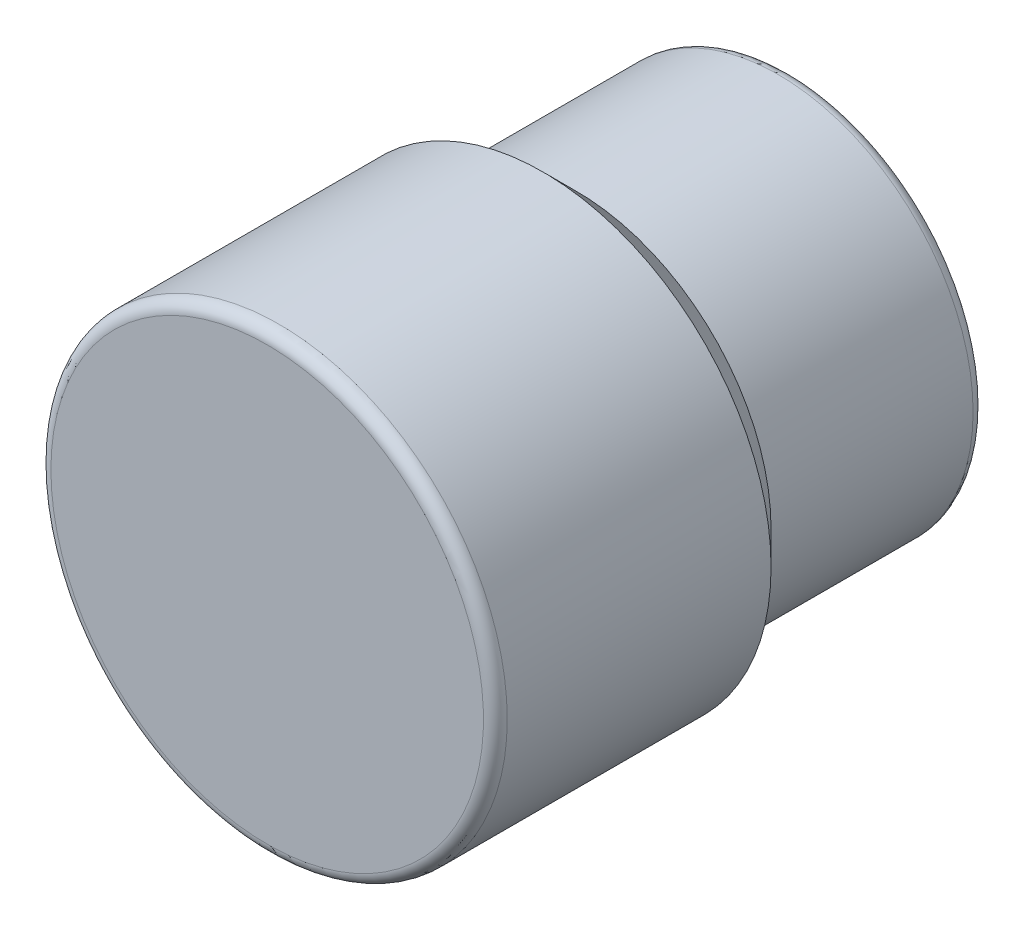
ISO-10303-21;
HEADER;
FILE_DESCRIPTION(('STEP AP214'),'2;1');
FILE_NAME('part.step','',(''),(''),'','','');
FILE_SCHEMA(('AUTOMOTIVE_DESIGN { 1 0 10303 214 1 1 1 1 }'));
ENDSEC;
DATA;
#1=APPLICATION_CONTEXT('core data for automotive mechanical design processes');
#2=APPLICATION_PROTOCOL_DEFINITION('international standard','automotive_design',2000,#1);
#3=PRODUCT_CONTEXT('',#1,'mechanical');
#4=PRODUCT('Part','Part','',(#3));
#5=PRODUCT_RELATED_PRODUCT_CATEGORY('part','',(#4));
#6=PRODUCT_DEFINITION_FORMATION('','',#4);
#7=PRODUCT_DEFINITION_CONTEXT('part definition',#1,'design');
#8=PRODUCT_DEFINITION('design','',#6,#7);
#9=PRODUCT_DEFINITION_SHAPE('','',#8);
#10=(LENGTH_UNIT() NAMED_UNIT(*) SI_UNIT(.MILLI.,.METRE.));
#11=(NAMED_UNIT(*) PLANE_ANGLE_UNIT() SI_UNIT($,.RADIAN.));
#12=(NAMED_UNIT(*) SI_UNIT($,.STERADIAN.) SOLID_ANGLE_UNIT());
#13=UNCERTAINTY_MEASURE_WITH_UNIT(LENGTH_MEASURE(1.E-05),#10,'distance_accuracy_value','');
#14=(GEOMETRIC_REPRESENTATION_CONTEXT(3) GLOBAL_UNCERTAINTY_ASSIGNED_CONTEXT((#13)) GLOBAL_UNIT_ASSIGNED_CONTEXT((#10,
#11,#12)) REPRESENTATION_CONTEXT('',''));
#15=CARTESIAN_POINT('',(0.,0.,0.));
#16=DIRECTION('',(0.,0.,1.));
#17=DIRECTION('',(1.,0.,0.));
#18=AXIS2_PLACEMENT_3D('',#15,#16,#17);
#19=CARTESIAN_POINT('',(0.,0.,-10.));
#20=DIRECTION('',(0.,0.,-1.));
#21=DIRECTION('',(-1.,0.,0.));
#22=AXIS2_PLACEMENT_3D('',#19,#20,#21);
#23=CONICAL_SURFACE('',#22,2.25000000000001,0.785398163397443);
#24=CARTESIAN_POINT('',(0.,0.,-11.));
#25=DIRECTION('',(0.,0.,1.));
#26=DIRECTION('',(1.,0.,0.));
#27=AXIS2_PLACEMENT_3D('',#24,#25,#26);
#28=CIRCLE('',#27,3.25);
#29=CARTESIAN_POINT('',(3.25,0.,-11.));
#30=VERTEX_POINT('',#29);
#31=EDGE_CURVE('E140',#30,#30,#28,.T.);
#32=ORIENTED_EDGE('',*,*,#31,.F.);
#33=EDGE_LOOP('',(#32));
#34=FACE_BOUND('',#33,.T.);
#35=CARTESIAN_POINT('',(1.50099522983919,2.6002,-10.7523368765014));
#36=CARTESIAN_POINT('',(1.55259609868699,2.5108246734409,-10.7007796282297));
#37=CARTESIAN_POINT('',(1.60505980551816,2.41995486765592,-10.652250381011));
#38=CARTESIAN_POINT('',(1.71203909585913,2.2346613014277,-10.5633944308211));
#39=CARTESIAN_POINT('',(1.7665648536637,2.14021991858899,-10.5231171679283));
#40=CARTESIAN_POINT('',(1.87651344492367,1.9497833723061,-10.4541214011367));
#41=CARTESIAN_POINT('',(1.93190827655764,1.85383670943934,-10.4252294765632));
#42=CARTESIAN_POINT('',(2.04391745837658,1.65983111561471,-10.3807154475149));
#43=CARTESIAN_POINT('',(2.10052838672042,1.56177811145955,-10.3650601139362));
#44=CARTESIAN_POINT('',(2.19809418606769,1.39278918990901,-10.3509349640468));
#45=CARTESIAN_POINT('',(2.23892300849229,1.32207159505638,-10.3488439681534));
#46=CARTESIAN_POINT('',(2.32051391392736,1.1807520014073,-10.3523665649125));
#47=CARTESIAN_POINT('',(2.36127596852554,1.11015005182235,-10.3579828586265));
#48=CARTESIAN_POINT('',(2.4424151890861,0.969612799324925,-10.3766004324418));
#49=CARTESIAN_POINT('',(2.48279187303035,0.899678331292341,-10.3896099737557));
#50=CARTESIAN_POINT('',(2.56284703049466,0.761018731156221,-10.4222999161722));
#51=CARTESIAN_POINT('',(2.6025255572956,0.692293506767517,-10.4419798058744));
#52=CARTESIAN_POINT('',(2.70415835910917,0.516260330310826,-10.5004033328943));
#53=CARTESIAN_POINT('',(2.76548248988375,0.410043820079267,-10.5435506299177));
#54=CARTESIAN_POINT('',(2.85565427353683,0.253861709383017,-10.6163890913151));
#55=CARTESIAN_POINT('',(2.88536990699724,0.202392722450494,-10.6419811618295));
#56=CARTESIAN_POINT('',(2.94425074749576,0.100408115114702,-10.6954982002593));
#57=CARTESIAN_POINT('',(2.97341627913002,0.0498919324943993,-10.7234217360755));
#58=CARTESIAN_POINT('',(3.00233686983989,-0.000199999999999897,-10.7523368765014));
#59=B_SPLINE_CURVE_WITH_KNOTS('',3,(#35,#36,#37,#38,#39,#40,#41,#42,#43,#44,#45,#46,#47,#48,#49,
#50,#51,#52,#53,#54,#55,#56,#57,#58),.UNSPECIFIED.,.F.,.F.,(4,2,2,2,2,2,2,2,2,2,2,4),(0.,
0.346330379495458,0.694678671839546,1.03749436384155,1.3794468751576,1.6241532765258,
1.8689454584818,2.11401171048941,2.35905917807699,2.74829168029632,2.94238019255173,
3.13635035111913),.UNSPECIFIED.);
#60=CARTESIAN_POINT('',(1.50111069989303,2.6,-10.7522213997861));
#61=VERTEX_POINT('',#60);
#62=CARTESIAN_POINT('',(3.00222139978605,0.,-10.7522213997861));
#63=VERTEX_POINT('',#62);
#64=EDGE_CURVE('E124',#61,#63,#59,.T.);
#65=ORIENTED_EDGE('',*,*,#64,.F.);
#66=CARTESIAN_POINT('',(-3.09158206523746,2.6,-11.789539536395));
#67=CARTESIAN_POINT('',(-3.01672971189078,2.6,-11.7322656761682));
#68=CARTESIAN_POINT('',(-2.94146940396406,2.6,-11.6755165151121));
#69=CARTESIAN_POINT('',(-2.78996782165253,2.6,-11.5633059180812));
#70=CARTESIAN_POINT('',(-2.71372631547698,2.6,-11.5078447953949));
#71=CARTESIAN_POINT('',(-2.55953974479171,2.6,-11.398053857449));
#72=CARTESIAN_POINT('',(-2.48158606883085,2.6,-11.3437360958426));
#73=CARTESIAN_POINT('',(-2.32437347335607,2.6,-11.2370299023076));
#74=CARTESIAN_POINT('',(-2.24511464490256,2.6,-11.1846413365976));
#75=CARTESIAN_POINT('',(-2.08013806157996,2.6,-11.0790703867817));
#76=CARTESIAN_POINT('',(-1.9943235289227,2.6,-11.0260384758092));
#77=CARTESIAN_POINT('',(-1.82070754408314,2.6,-10.9233384000762));
#78=CARTESIAN_POINT('',(-1.73290635376894,2.6,-10.8736697953934));
#79=CARTESIAN_POINT('',(-1.55526488307799,2.6,-10.7787338032194));
#80=CARTESIAN_POINT('',(-1.4654312405361,2.6,-10.7334540924078));
#81=CARTESIAN_POINT('',(-1.28325003489121,2.6,-10.6483184933068));
#82=CARTESIAN_POINT('',(-1.19090366829887,2.6,-10.6084600759227));
#83=CARTESIAN_POINT('',(-1.01227657034587,2.6,-10.5390116508489));
#84=CARTESIAN_POINT('',(-0.926236103109217,2.6,-10.5088099774988));
#85=CARTESIAN_POINT('',(-0.751998212766526,2.6,-10.45529748976));
#86=CARTESIAN_POINT('',(-0.663800649610299,2.6,-10.4319871240846));
#87=CARTESIAN_POINT('',(-0.487290602982474,2.6,-10.3938938428253));
#88=CARTESIAN_POINT('',(-0.399011537343982,2.6,-10.3789586610721));
#89=CARTESIAN_POINT('',(-0.221401401800931,2.6,-10.3579213462266));
#90=CARTESIAN_POINT('',(-0.132070542055418,2.6,-10.3518174777607));
#91=CARTESIAN_POINT('',(0.0430417945486777,2.6,-10.3489433001458));
#92=CARTESIAN_POINT('',(0.128817183108501,2.6,-10.3517972196752));
#93=CARTESIAN_POINT('',(0.299679381403934,2.6,-10.3658276523322));
#94=CARTESIAN_POINT('',(0.38476612649279,2.6,-10.377004937866));
#95=CARTESIAN_POINT('',(0.555078880900565,2.6,-10.4072458234194));
#96=CARTESIAN_POINT('',(0.640280061365675,2.6,-10.4264471591075));
#97=CARTESIAN_POINT('',(0.808803791231872,2.6,-10.4716862226573));
#98=CARTESIAN_POINT('',(0.892126462186343,2.6,-10.4977235067961));
#99=CARTESIAN_POINT('',(1.15019794632633,2.6,-10.5882723613981));
#100=CARTESIAN_POINT('',(1.32140370199023,2.6,-10.6629159857519));
#101=CARTESIAN_POINT('',(1.57196404804421,2.6,-10.7874041696948));
#102=CARTESIAN_POINT('',(1.65459709227537,2.6,-10.8310844069807));
#103=CARTESIAN_POINT('',(1.81799091748646,2.6,-10.9218243151292));
#104=CARTESIAN_POINT('',(1.89875202655942,2.6,-10.9688833877691));
#105=CARTESIAN_POINT('',(2.05466707158067,2.6,-11.0633070853777));
#106=CARTESIAN_POINT('',(2.12990077571505,2.6,-11.1105414829838));
#107=CARTESIAN_POINT('',(2.2790774950493,2.6,-11.2070159528967));
#108=CARTESIAN_POINT('',(2.35302041259547,2.6,-11.2562561760216));
#109=CARTESIAN_POINT('',(2.49918665411732,2.6,-11.3559806955678));
#110=CARTESIAN_POINT('',(2.57141903140301,2.6,-11.4064517775737));
#111=CARTESIAN_POINT('',(2.714893787393,2.6,-11.5087422993976));
#112=CARTESIAN_POINT('',(2.78613643339249,2.6,-11.5605613638642));
#113=CARTESIAN_POINT('',(2.85696429618713,2.6,-11.6129321751343));
#114=B_SPLINE_CURVE_WITH_KNOTS('',3,(#66,#67,#68,#69,#70,#71,#72,#73,#74,#75,#76,#77,#78,#79,
#80,#81,#82,#83,#84,#85,#86,#87,#88,#89,#90,#91,#92,#93,#94,#95,#96,#97,#98,#99,#100,#101,#102,
#103,#104,#105,#106,#107,#108,#109,#110,#111,#112,#113),.UNSPECIFIED.,.F.,.F.,(4,2,2,2,2,2,2,2,
2,2,2,2,2,2,2,2,2,2,2,2,2,2,2,4),(0.,0.282757013358821,0.565582096041548,0.85059266053329,
1.13558342340908,1.43815883103438,1.74069458487069,2.04235463960104,2.34387348025676,
2.6171979950105,2.8905403028079,3.15873702515367,3.42688103905626,3.68392924400682,
3.94100130593313,4.20268017594143,4.46434206451872,5.02291890092957,5.30329810341539,
5.58362778660376,5.8500926727625,6.11657763155413,6.38091624363117,6.64518202122644),.UNSPECIFIED.);
#115=CARTESIAN_POINT('',(-1.50111069989303,2.6,-10.7522213997861));
#116=VERTEX_POINT('',#115);
#117=EDGE_CURVE('E61',#116,#61,#114,.T.);
#118=ORIENTED_EDGE('',*,*,#117,.F.);
#119=CARTESIAN_POINT('',(-3.00233686983989,-0.000199999999999961,-10.7523368765014));
#120=CARTESIAN_POINT('',(-2.95073600099209,0.089175326559097,-10.7007796282297));
#121=CARTESIAN_POINT('',(-2.89827229416092,0.180045132344079,-10.652250381011));
#122=CARTESIAN_POINT('',(-2.79129300381995,0.365338698572304,-10.5633944308211));
#123=CARTESIAN_POINT('',(-2.73676724601538,0.459780081411012,-10.5231171679283));
#124=CARTESIAN_POINT('',(-2.62681865475541,0.650216627693896,-10.4541214011367));
#125=CARTESIAN_POINT('',(-2.57142382312144,0.746163290560655,-10.4252294765632));
#126=CARTESIAN_POINT('',(-2.4594146413025,0.940168884385287,-10.3807154475149));
#127=CARTESIAN_POINT('',(-2.40280371295866,1.03822188854045,-10.3650601139362));
#128=CARTESIAN_POINT('',(-2.30523791361139,1.20721081009099,-10.3509349640468));
#129=CARTESIAN_POINT('',(-2.26440909118679,1.27792840494362,-10.3488439681534));
#130=CARTESIAN_POINT('',(-2.18281818575172,1.4192479985927,-10.3523665649125));
#131=CARTESIAN_POINT('',(-2.14205613115354,1.48984994817765,-10.3579828586265));
#132=CARTESIAN_POINT('',(-2.06091691059298,1.63038720067508,-10.3766004324418));
#133=CARTESIAN_POINT('',(-2.02054022664873,1.70032166870766,-10.3896099737557));
#134=CARTESIAN_POINT('',(-1.94048506918442,1.83898126884378,-10.4222999161722));
#135=CARTESIAN_POINT('',(-1.90080654238348,1.90770649323248,-10.4419798058744));
#136=CARTESIAN_POINT('',(-1.79917374056991,2.08373966968917,-10.5004033328943));
#137=CARTESIAN_POINT('',(-1.73784960979533,2.18995617992073,-10.5435506299177));
#138=CARTESIAN_POINT('',(-1.64767782614225,2.34613829061698,-10.6163890913151));
#139=CARTESIAN_POINT('',(-1.61796219268184,2.39760727754951,-10.6419811618295));
#140=CARTESIAN_POINT('',(-1.55908135218332,2.4995918848853,-10.6954982002593));
#141=CARTESIAN_POINT('',(-1.52991582054906,2.5501080675056,-10.7234217360755));
#142=CARTESIAN_POINT('',(-1.50099522983919,2.6002,-10.7523368765014));
#143=B_SPLINE_CURVE_WITH_KNOTS('',3,(#119,#120,#121,#122,#123,#124,#125,#126,#127,#128,#129,
#130,#131,#132,#133,#134,#135,#136,#137,#138,#139,#140,#141,#142),.UNSPECIFIED.,.F.,.F.,(4,2,2,
2,2,2,2,2,2,2,2,4),(0.,0.346330379495457,0.694678671839545,1.03749436384155,1.3794468751576,
1.6241532765258,1.8689454584818,2.11401171048941,2.35905917807699,2.74829168029632,
2.94238019255173,3.13635035111913),.UNSPECIFIED.);
#144=CARTESIAN_POINT('',(-3.00222139978605,0.,-10.7522213997861));
#145=VERTEX_POINT('',#144);
#146=EDGE_CURVE('E193',#145,#116,#143,.T.);
#147=ORIENTED_EDGE('',*,*,#146,.F.);
#148=CARTESIAN_POINT('',(-1.50099522983919,-2.6002,-10.7523368765014));
#149=CARTESIAN_POINT('',(-1.55259609868699,-2.5108246734409,-10.7007796282297));
#150=CARTESIAN_POINT('',(-1.60505980551816,-2.41995486765592,-10.652250381011));
#151=CARTESIAN_POINT('',(-1.71203909585913,-2.2346613014277,-10.5633944308211));
#152=CARTESIAN_POINT('',(-1.7665648536637,-2.14021991858899,-10.5231171679283));
#153=CARTESIAN_POINT('',(-1.87651344492367,-1.9497833723061,-10.4541214011367));
#154=CARTESIAN_POINT('',(-1.93190827655764,-1.85383670943934,-10.4252294765632));
#155=CARTESIAN_POINT('',(-2.04391745837658,-1.65983111561471,-10.3807154475149));
#156=CARTESIAN_POINT('',(-2.10052838672042,-1.56177811145955,-10.3650601139362));
#157=CARTESIAN_POINT('',(-2.19809418606769,-1.39278918990901,-10.3509349640468));
#158=CARTESIAN_POINT('',(-2.23892300849229,-1.32207159505638,-10.3488439681534));
#159=CARTESIAN_POINT('',(-2.32051391392736,-1.1807520014073,-10.3523665649125));
#160=CARTESIAN_POINT('',(-2.36127596852554,-1.11015005182235,-10.3579828586265));
#161=CARTESIAN_POINT('',(-2.4424151890861,-0.969612799324925,-10.3766004324418));
#162=CARTESIAN_POINT('',(-2.48279187303035,-0.899678331292341,-10.3896099737557));
#163=CARTESIAN_POINT('',(-2.56284703049466,-0.76101873115622,-10.4222999161722));
#164=CARTESIAN_POINT('',(-2.6025255572956,-0.692293506767516,-10.4419798058744));
#165=CARTESIAN_POINT('',(-2.70415835910917,-0.516260330310826,-10.5004033328943));
#166=CARTESIAN_POINT('',(-2.76548248988375,-0.410043820079267,-10.5435506299177));
#167=CARTESIAN_POINT('',(-2.85565427353683,-0.253861709383016,-10.6163890913151));
#168=CARTESIAN_POINT('',(-2.88536990699724,-0.202392722450493,-10.6419811618295));
#169=CARTESIAN_POINT('',(-2.94425074749576,-0.100408115114702,-10.6954982002593));
#170=CARTESIAN_POINT('',(-2.97341627913002,-0.0498919324943995,-10.7234217360755));
#171=CARTESIAN_POINT('',(-3.00233686983989,0.000199999999999893,-10.7523368765014));
#172=B_SPLINE_CURVE_WITH_KNOTS('',3,(#148,#149,#150,#151,#152,#153,#154,#155,#156,#157,#158,
#159,#160,#161,#162,#163,#164,#165,#166,#167,#168,#169,#170,#171),.UNSPECIFIED.,.F.,.F.,(4,2,2,
2,2,2,2,2,2,2,2,4),(0.,0.346330379495457,0.694678671839546,1.03749436384155,1.3794468751576,
1.6241532765258,1.8689454584818,2.11401171048941,2.35905917807699,2.74829168029632,
2.94238019255173,3.13635035111913),.UNSPECIFIED.);
#173=CARTESIAN_POINT('',(-1.50111069989303,-2.6,-10.7522213997861));
#174=VERTEX_POINT('',#173);
#175=EDGE_CURVE('E187',#174,#145,#172,.T.);
#176=ORIENTED_EDGE('',*,*,#175,.F.);
#177=CARTESIAN_POINT('',(-3.09158206523746,-2.6,-11.789539536395));
#178=CARTESIAN_POINT('',(-3.01672971189078,-2.6,-11.7322656761682));
#179=CARTESIAN_POINT('',(-2.94146940396406,-2.6,-11.6755165151121));
#180=CARTESIAN_POINT('',(-2.78996782165253,-2.6,-11.5633059180812));
#181=CARTESIAN_POINT('',(-2.71372631547698,-2.6,-11.5078447953949));
#182=CARTESIAN_POINT('',(-2.55953974479171,-2.6,-11.398053857449));
#183=CARTESIAN_POINT('',(-2.48158606883085,-2.6,-11.3437360958426));
#184=CARTESIAN_POINT('',(-2.32437347335607,-2.6,-11.2370299023076));
#185=CARTESIAN_POINT('',(-2.24511464490256,-2.6,-11.1846413365976));
#186=CARTESIAN_POINT('',(-2.08013806157996,-2.6,-11.0790703867817));
#187=CARTESIAN_POINT('',(-1.9943235289227,-2.6,-11.0260384758092));
#188=CARTESIAN_POINT('',(-1.82070754408314,-2.6,-10.9233384000762));
#189=CARTESIAN_POINT('',(-1.73290635376894,-2.6,-10.8736697953934));
#190=CARTESIAN_POINT('',(-1.55526488307799,-2.6,-10.7787338032194));
#191=CARTESIAN_POINT('',(-1.4654312405361,-2.6,-10.7334540924078));
#192=CARTESIAN_POINT('',(-1.28325003489121,-2.6,-10.6483184933068));
#193=CARTESIAN_POINT('',(-1.19090366829887,-2.6,-10.6084600759227));
#194=CARTESIAN_POINT('',(-1.01227657034587,-2.6,-10.5390116508489));
#195=CARTESIAN_POINT('',(-0.926236103109217,-2.6,-10.5088099774988));
#196=CARTESIAN_POINT('',(-0.751998212766526,-2.6,-10.45529748976));
#197=CARTESIAN_POINT('',(-0.663800649610299,-2.6,-10.4319871240846));
#198=CARTESIAN_POINT('',(-0.487290602982474,-2.6,-10.3938938428253));
#199=CARTESIAN_POINT('',(-0.399011537343982,-2.6,-10.3789586610721));
#200=CARTESIAN_POINT('',(-0.221401401800931,-2.6,-10.3579213462266));
#201=CARTESIAN_POINT('',(-0.132070542055418,-2.6,-10.3518174777607));
#202=CARTESIAN_POINT('',(0.0430417945486777,-2.6,-10.3489433001458));
#203=CARTESIAN_POINT('',(0.128817183108501,-2.6,-10.3517972196752));
#204=CARTESIAN_POINT('',(0.299679381403934,-2.6,-10.3658276523322));
#205=CARTESIAN_POINT('',(0.38476612649279,-2.6,-10.377004937866));
#206=CARTESIAN_POINT('',(0.555078880900565,-2.6,-10.4072458234194));
#207=CARTESIAN_POINT('',(0.640280061365675,-2.6,-10.4264471591075));
#208=CARTESIAN_POINT('',(0.808803791231872,-2.6,-10.4716862226573));
#209=CARTESIAN_POINT('',(0.892126462186343,-2.6,-10.4977235067961));
#210=CARTESIAN_POINT('',(1.15019794632633,-2.6,-10.5882723613981));
#211=CARTESIAN_POINT('',(1.32140370199023,-2.6,-10.6629159857519));
#212=CARTESIAN_POINT('',(1.57196404804421,-2.6,-10.7874041696948));
#213=CARTESIAN_POINT('',(1.65459709227537,-2.6,-10.8310844069807));
#214=CARTESIAN_POINT('',(1.81799091748646,-2.6,-10.9218243151292));
#215=CARTESIAN_POINT('',(1.89875202655942,-2.6,-10.9688833877691));
#216=CARTESIAN_POINT('',(2.05466707158067,-2.6,-11.0633070853777));
#217=CARTESIAN_POINT('',(2.12990077571505,-2.6,-11.1105414829838));
#218=CARTESIAN_POINT('',(2.2790774950493,-2.6,-11.2070159528967));
#219=CARTESIAN_POINT('',(2.35302041259547,-2.6,-11.2562561760216));
#220=CARTESIAN_POINT('',(2.49918665411732,-2.6,-11.3559806955678));
#221=CARTESIAN_POINT('',(2.57141903140301,-2.6,-11.4064517775737));
#222=CARTESIAN_POINT('',(2.714893787393,-2.6,-11.5087422993976));
#223=CARTESIAN_POINT('',(2.78613643339249,-2.6,-11.5605613638642));
#224=CARTESIAN_POINT('',(2.85696429618713,-2.6,-11.6129321751343));
#225=B_SPLINE_CURVE_WITH_KNOTS('',3,(#177,#178,#179,#180,#181,#182,#183,#184,#185,#186,#187,
#188,#189,#190,#191,#192,#193,#194,#195,#196,#197,#198,#199,#200,#201,#202,#203,#204,#205,#206,
#207,#208,#209,#210,#211,#212,#213,#214,#215,#216,#217,#218,#219,#220,#221,#222,#223,#224),
.UNSPECIFIED.,.F.,.F.,(4,2,2,2,2,2,2,2,2,2,2,2,2,2,2,2,2,2,2,2,2,2,2,4),(0.,0.282757013358821,
0.565582096041548,0.85059266053329,1.13558342340908,1.43815883103438,1.74069458487069,
2.04235463960104,2.34387348025676,2.6171979950105,2.8905403028079,3.15873702515367,
3.42688103905626,3.68392924400682,3.94100130593313,4.20268017594143,4.46434206451872,
5.02291890092957,5.30329810341539,5.58362778660376,5.8500926727625,6.11657763155413,
6.38091624363117,6.64518202122644),.UNSPECIFIED.);
#226=CARTESIAN_POINT('',(1.50111069989303,-2.6,-10.7522213997861));
#227=VERTEX_POINT('',#226);
#228=EDGE_CURVE('E157',#227,#174,#225,.F.);
#229=ORIENTED_EDGE('',*,*,#228,.F.);
#230=CARTESIAN_POINT('',(3.00233686983989,0.000199999999999961,-10.7523368765014));
#231=CARTESIAN_POINT('',(2.95073600099209,-0.0891753265590972,-10.7007796282297));
#232=CARTESIAN_POINT('',(2.89827229416092,-0.180045132344079,-10.652250381011));
#233=CARTESIAN_POINT('',(2.79129300381995,-0.365338698572305,-10.5633944308211));
#234=CARTESIAN_POINT('',(2.73676724601538,-0.459780081411012,-10.5231171679283));
#235=CARTESIAN_POINT('',(2.62681865475541,-0.650216627693897,-10.4541214011367));
#236=CARTESIAN_POINT('',(2.57142382312144,-0.746163290560655,-10.4252294765632));
#237=CARTESIAN_POINT('',(2.4594146413025,-0.940168884385287,-10.3807154475149));
#238=CARTESIAN_POINT('',(2.40280371295866,-1.03822188854045,-10.3650601139362));
#239=CARTESIAN_POINT('',(2.30523791361139,-1.20721081009099,-10.3509349640468));
#240=CARTESIAN_POINT('',(2.26440909118679,-1.27792840494362,-10.3488439681534));
#241=CARTESIAN_POINT('',(2.18281818575172,-1.4192479985927,-10.3523665649125));
#242=CARTESIAN_POINT('',(2.14205613115354,-1.48984994817765,-10.3579828586265));
#243=CARTESIAN_POINT('',(2.06091691059298,-1.63038720067508,-10.3766004324418));
#244=CARTESIAN_POINT('',(2.02054022664873,-1.70032166870766,-10.3896099737557));
#245=CARTESIAN_POINT('',(1.94048506918442,-1.83898126884378,-10.4222999161722));
#246=CARTESIAN_POINT('',(1.90080654238348,-1.90770649323248,-10.4419798058744));
#247=CARTESIAN_POINT('',(1.79917374056991,-2.08373966968917,-10.5004033328943));
#248=CARTESIAN_POINT('',(1.73784960979533,-2.18995617992073,-10.5435506299177));
#249=CARTESIAN_POINT('',(1.64767782614225,-2.34613829061698,-10.6163890913151));
#250=CARTESIAN_POINT('',(1.61796219268184,-2.39760727754951,-10.6419811618295));
#251=CARTESIAN_POINT('',(1.55908135218332,-2.4995918848853,-10.6954982002593));
#252=CARTESIAN_POINT('',(1.52991582054906,-2.5501080675056,-10.7234217360755));
#253=CARTESIAN_POINT('',(1.50099522983919,-2.6002,-10.7523368765014));
#254=B_SPLINE_CURVE_WITH_KNOTS('',3,(#230,#231,#232,#233,#234,#235,#236,#237,#238,#239,#240,
#241,#242,#243,#244,#245,#246,#247,#248,#249,#250,#251,#252,#253),.UNSPECIFIED.,.F.,.F.,(4,2,2,
2,2,2,2,2,2,2,2,4),(0.,0.346330379495458,0.694678671839546,1.03749436384155,1.3794468751576,
1.6241532765258,1.8689454584818,2.11401171048941,2.35905917807699,2.74829168029632,
2.94238019255173,3.13635035111913),.UNSPECIFIED.);
#255=EDGE_CURVE('E149',#63,#227,#254,.T.);
#256=ORIENTED_EDGE('',*,*,#255,.F.);
#257=EDGE_LOOP('',(#65,#118,#147,#176,#229,#256));
#258=FACE_BOUND('',#257,.T.);
#259=ADVANCED_FACE('F38',(#34,#258),#23,.F.);
#260=CARTESIAN_POINT('',(0.,0.,0.));
#261=DIRECTION('',(0.,0.,-1.));
#262=DIRECTION('',(-1.,0.,0.));
#263=AXIS2_PLACEMENT_3D('',#260,#261,#262);
#264=PLANE('',#263);
#265=CARTESIAN_POINT('',(0.,0.,0.));
#266=DIRECTION('',(0.,0.,-1.));
#267=DIRECTION('',(-1.,0.,0.));
#268=AXIS2_PLACEMENT_3D('',#265,#266,#267);
#269=CIRCLE('',#268,4.55);
#270=CARTESIAN_POINT('',(-4.55,0.,0.));
#271=VERTEX_POINT('',#270);
#272=EDGE_CURVE('E233',#271,#271,#269,.F.);
#273=ORIENTED_EDGE('',*,*,#272,.T.);
#274=EDGE_LOOP('',(#273));
#275=FACE_BOUND('',#274,.T.);
#276=ADVANCED_FACE('F221',(#275),#264,.F.);
#277=CARTESIAN_POINT('',(0.,0.,0.));
#278=DIRECTION('',(0.,0.,1.));
#279=DIRECTION('',(1.,0.,0.));
#280=AXIS2_PLACEMENT_3D('',#277,#278,#279);
#281=CYLINDRICAL_SURFACE('',#280,4.8);
#282=CARTESIAN_POINT('',(0.,0.,-0.25));
#283=DIRECTION('',(0.,0.,-1.));
#284=DIRECTION('',(-1.,0.,0.));
#285=AXIS2_PLACEMENT_3D('',#282,#283,#284);
#286=CIRCLE('',#285,4.8);
#287=CARTESIAN_POINT('',(-4.8,0.,-0.25));
#288=VERTEX_POINT('',#287);
#289=EDGE_CURVE('E235',#288,#288,#286,.T.);
#290=ORIENTED_EDGE('',*,*,#289,.T.);
#291=EDGE_LOOP('',(#290));
#292=FACE_BOUND('',#291,.T.);
#293=CARTESIAN_POINT('',(0.,0.,-5.8));
#294=DIRECTION('',(0.,0.,1.));
#295=DIRECTION('',(1.,0.,0.));
#296=AXIS2_PLACEMENT_3D('',#293,#294,#295);
#297=CIRCLE('',#296,4.8);
#298=CARTESIAN_POINT('',(4.8,0.,-5.8));
#299=VERTEX_POINT('',#298);
#300=EDGE_CURVE('E146',#299,#299,#297,.T.);
#301=ORIENTED_EDGE('',*,*,#300,.T.);
#302=EDGE_LOOP('',(#301));
#303=FACE_BOUND('',#302,.T.);
#304=ADVANCED_FACE('F226',(#292,#303),#281,.T.);
#305=CARTESIAN_POINT('',(0.,0.,-6.5));
#306=DIRECTION('',(0.,0.,1.));
#307=DIRECTION('',(1.,0.,0.));
#308=AXIS2_PLACEMENT_3D('',#305,#306,#307);
#309=CONICAL_SURFACE('',#308,4.1,0.78539816339745);
#310=ORIENTED_EDGE('',*,*,#300,.F.);
#311=EDGE_LOOP('',(#310));
#312=FACE_BOUND('',#311,.T.);
#313=CARTESIAN_POINT('',(0.,0.,-6.5));
#314=DIRECTION('',(0.,0.,1.));
#315=DIRECTION('',(1.,0.,0.));
#316=AXIS2_PLACEMENT_3D('',#313,#314,#315);
#317=CIRCLE('',#316,4.1);
#318=CARTESIAN_POINT('',(4.1,0.,-6.5));
#319=VERTEX_POINT('',#318);
#320=EDGE_CURVE('E143',#319,#319,#317,.T.);
#321=ORIENTED_EDGE('',*,*,#320,.T.);
#322=EDGE_LOOP('',(#321));
#323=FACE_BOUND('',#322,.T.);
#324=ADVANCED_FACE('F262',(#312,#323),#309,.T.);
#325=CARTESIAN_POINT('',(0.,0.,0.));
#326=DIRECTION('',(0.,0.,1.));
#327=DIRECTION('',(1.,0.,0.));
#328=AXIS2_PLACEMENT_3D('',#325,#326,#327);
#329=CYLINDRICAL_SURFACE('',#328,4.1);
#330=CARTESIAN_POINT('',(0.,0.,-10.75));
#331=DIRECTION('',(0.,0.,1.));
#332=DIRECTION('',(1.,0.,0.));
#333=AXIS2_PLACEMENT_3D('',#330,#331,#332);
#334=CIRCLE('',#333,4.1);
#335=CARTESIAN_POINT('',(4.1,0.,-10.75));
#336=VERTEX_POINT('',#335);
#337=EDGE_CURVE('E46',#336,#336,#334,.T.);
#338=ORIENTED_EDGE('',*,*,#337,.T.);
#339=EDGE_LOOP('',(#338));
#340=FACE_BOUND('',#339,.T.);
#341=ORIENTED_EDGE('',*,*,#320,.F.);
#342=EDGE_LOOP('',(#341));
#343=FACE_BOUND('',#342,.T.);
#344=ADVANCED_FACE('F218',(#340,#343),#329,.T.);
#345=CARTESIAN_POINT('',(0.,4.1,-11.));
#346=DIRECTION('',(0.,0.,1.));
#347=DIRECTION('',(1.,0.,0.));
#348=AXIS2_PLACEMENT_3D('',#345,#346,#347);
#349=PLANE('',#348);
#350=CARTESIAN_POINT('',(0.,0.,-11.));
#351=DIRECTION('',(0.,0.,1.));
#352=DIRECTION('',(1.,0.,0.));
#353=AXIS2_PLACEMENT_3D('',#350,#351,#352);
#354=CIRCLE('',#353,3.85);
#355=CARTESIAN_POINT('',(3.85,0.,-11.));
#356=VERTEX_POINT('',#355);
#357=EDGE_CURVE('E11',#356,#356,#354,.F.);
#358=ORIENTED_EDGE('',*,*,#357,.T.);
#359=EDGE_LOOP('',(#358));
#360=FACE_BOUND('',#359,.T.);
#361=ORIENTED_EDGE('',*,*,#31,.T.);
#362=EDGE_LOOP('',(#361));
#363=FACE_BOUND('',#362,.T.);
#364=ADVANCED_FACE('F214',(#360,#363),#349,.F.);
#365=CARTESIAN_POINT('',(3.00222139978605,0.,-5.5));
#366=DIRECTION('',(-0.866025403784439,-0.5,0.));
#367=DIRECTION('',(0.5,-0.866025403784439,0.));
#368=AXIS2_PLACEMENT_3D('',#365,#366,#367);
#369=PLANE('',#368);
#370=ORIENTED_EDGE('',*,*,#64,.T.);
#371=DIRECTION('',(0.,0.,-1.));
#372=VECTOR('',#371,1.);
#373=CARTESIAN_POINT('',(3.00222139978605,0.,-5.5));
#374=LINE('',#373,#372);
#375=CARTESIAN_POINT('',(3.00222139978605,0.,-5.5));
#376=VERTEX_POINT('',#375);
#377=EDGE_CURVE('E53',#376,#63,#374,.T.);
#378=ORIENTED_EDGE('',*,*,#377,.F.);
#379=DIRECTION('',(-0.5,0.866025403784439,0.));
#380=VECTOR('',#379,1.);
#381=CARTESIAN_POINT('',(3.00222139978605,0.,-5.5));
#382=LINE('',#381,#380);
#383=CARTESIAN_POINT('',(1.50111069989303,2.6,-5.5));
#384=VERTEX_POINT('',#383);
#385=EDGE_CURVE('E109',#376,#384,#382,.T.);
#386=ORIENTED_EDGE('',*,*,#385,.T.);
#387=DIRECTION('',(0.,0.,-1.));
#388=VECTOR('',#387,1.);
#389=CARTESIAN_POINT('',(1.50111069989303,2.6,-5.5));
#390=LINE('',#389,#388);
#391=EDGE_CURVE('E138',#384,#61,#390,.T.);
#392=ORIENTED_EDGE('',*,*,#391,.T.);
#393=EDGE_LOOP('',(#370,#378,#386,#392));
#394=FACE_BOUND('',#393,.T.);
#395=ADVANCED_FACE('F122',(#394),#369,.T.);
#396=CARTESIAN_POINT('',(1.50111069989303,2.6,-5.5));
#397=DIRECTION('',(0.,-1.,0.));
#398=DIRECTION('',(1.,0.,0.));
#399=AXIS2_PLACEMENT_3D('',#396,#397,#398);
#400=PLANE('',#399);
#401=ORIENTED_EDGE('',*,*,#117,.T.);
#402=ORIENTED_EDGE('',*,*,#391,.F.);
#403=DIRECTION('',(-1.,0.,0.));
#404=VECTOR('',#403,1.);
#405=CARTESIAN_POINT('',(1.50111069989303,2.6,-5.5));
#406=LINE('',#405,#404);
#407=CARTESIAN_POINT('',(-1.50111069989303,2.6,-5.5));
#408=VERTEX_POINT('',#407);
#409=EDGE_CURVE('E113',#384,#408,#406,.T.);
#410=ORIENTED_EDGE('',*,*,#409,.T.);
#411=DIRECTION('',(0.,0.,-1.));
#412=VECTOR('',#411,1.);
#413=CARTESIAN_POINT('',(-1.50111069989303,2.6,-5.5));
#414=LINE('',#413,#412);
#415=EDGE_CURVE('E136',#408,#116,#414,.T.);
#416=ORIENTED_EDGE('',*,*,#415,.T.);
#417=EDGE_LOOP('',(#401,#402,#410,#416));
#418=FACE_BOUND('',#417,.T.);
#419=ADVANCED_FACE('F209',(#418),#400,.T.);
#420=CARTESIAN_POINT('',(-1.50111069989303,2.6,-5.5));
#421=DIRECTION('',(0.866025403784439,-0.5,0.));
#422=DIRECTION('',(0.5,0.866025403784439,0.));
#423=AXIS2_PLACEMENT_3D('',#420,#421,#422);
#424=PLANE('',#423);
#425=ORIENTED_EDGE('',*,*,#146,.T.);
#426=ORIENTED_EDGE('',*,*,#415,.F.);
#427=DIRECTION('',(-0.5,-0.866025403784439,0.));
#428=VECTOR('',#427,1.);
#429=CARTESIAN_POINT('',(-1.50111069989303,2.6,-5.5));
#430=LINE('',#429,#428);
#431=CARTESIAN_POINT('',(-3.00222139978605,0.,-5.5));
#432=VERTEX_POINT('',#431);
#433=EDGE_CURVE('E405',#408,#432,#430,.T.);
#434=ORIENTED_EDGE('',*,*,#433,.T.);
#435=DIRECTION('',(0.,0.,-1.));
#436=VECTOR('',#435,1.);
#437=CARTESIAN_POINT('',(-3.00222139978605,0.,-5.5));
#438=LINE('',#437,#436);
#439=EDGE_CURVE('E133',#432,#145,#438,.T.);
#440=ORIENTED_EDGE('',*,*,#439,.T.);
#441=EDGE_LOOP('',(#425,#426,#434,#440));
#442=FACE_BOUND('',#441,.T.);
#443=ADVANCED_FACE('F183',(#442),#424,.T.);
#444=CARTESIAN_POINT('',(-3.00222139978605,0.,-5.5));
#445=DIRECTION('',(0.866025403784439,0.5,0.));
#446=DIRECTION('',(-0.5,0.866025403784439,0.));
#447=AXIS2_PLACEMENT_3D('',#444,#445,#446);
#448=PLANE('',#447);
#449=ORIENTED_EDGE('',*,*,#175,.T.);
#450=ORIENTED_EDGE('',*,*,#439,.F.);
#451=DIRECTION('',(0.5,-0.866025403784439,0.));
#452=VECTOR('',#451,1.);
#453=CARTESIAN_POINT('',(-3.00222139978605,0.,-5.5));
#454=LINE('',#453,#452);
#455=CARTESIAN_POINT('',(-1.50111069989303,-2.6,-5.5));
#456=VERTEX_POINT('',#455);
#457=EDGE_CURVE('E407',#432,#456,#454,.T.);
#458=ORIENTED_EDGE('',*,*,#457,.T.);
#459=DIRECTION('',(0.,0.,-1.));
#460=VECTOR('',#459,1.);
#461=CARTESIAN_POINT('',(-1.50111069989303,-2.6,-5.5));
#462=LINE('',#461,#460);
#463=EDGE_CURVE('E127',#456,#174,#462,.T.);
#464=ORIENTED_EDGE('',*,*,#463,.T.);
#465=EDGE_LOOP('',(#449,#450,#458,#464));
#466=FACE_BOUND('',#465,.T.);
#467=ADVANCED_FACE('F178',(#466),#448,.T.);
#468=CARTESIAN_POINT('',(-1.50111069989303,-2.6,-5.5));
#469=DIRECTION('',(0.,1.,0.));
#470=DIRECTION('',(-1.,0.,0.));
#471=AXIS2_PLACEMENT_3D('',#468,#469,#470);
#472=PLANE('',#471);
#473=ORIENTED_EDGE('',*,*,#228,.T.);
#474=ORIENTED_EDGE('',*,*,#463,.F.);
#475=DIRECTION('',(1.,0.,0.));
#476=VECTOR('',#475,1.);
#477=CARTESIAN_POINT('',(-1.50111069989303,-2.6,-5.5));
#478=LINE('',#477,#476);
#479=CARTESIAN_POINT('',(1.50111069989303,-2.6,-5.5));
#480=VERTEX_POINT('',#479);
#481=EDGE_CURVE('E120',#456,#480,#478,.T.);
#482=ORIENTED_EDGE('',*,*,#481,.T.);
#483=DIRECTION('',(0.,0.,-1.));
#484=VECTOR('',#483,1.);
#485=CARTESIAN_POINT('',(1.50111069989303,-2.6,-5.5));
#486=LINE('',#485,#484);
#487=EDGE_CURVE('E119',#480,#227,#486,.T.);
#488=ORIENTED_EDGE('',*,*,#487,.T.);
#489=EDGE_LOOP('',(#473,#474,#482,#488));
#490=FACE_BOUND('',#489,.T.);
#491=ADVANCED_FACE('F171',(#490),#472,.T.);
#492=CARTESIAN_POINT('',(1.50111069989303,-2.6,-5.5));
#493=DIRECTION('',(-0.866025403784439,0.5,0.));
#494=DIRECTION('',(-0.5,-0.866025403784439,0.));
#495=AXIS2_PLACEMENT_3D('',#492,#493,#494);
#496=PLANE('',#495);
#497=ORIENTED_EDGE('',*,*,#255,.T.);
#498=ORIENTED_EDGE('',*,*,#487,.F.);
#499=DIRECTION('',(0.5,0.866025403784439,0.));
#500=VECTOR('',#499,1.);
#501=CARTESIAN_POINT('',(1.50111069989303,-2.6,-5.5));
#502=LINE('',#501,#500);
#503=EDGE_CURVE('E101',#480,#376,#502,.T.);
#504=ORIENTED_EDGE('',*,*,#503,.T.);
#505=ORIENTED_EDGE('',*,*,#377,.T.);
#506=EDGE_LOOP('',(#497,#498,#504,#505));
#507=FACE_BOUND('',#506,.T.);
#508=ADVANCED_FACE('F117',(#507),#496,.T.);
#509=CARTESIAN_POINT('',(-3.00222139978605,0.,-5.5));
#510=CARTESIAN_POINT('',(-2.85211032979675,0.,-5.));
#511=CARTESIAN_POINT('',(0.,0.,-5.));
#512=CARTESIAN_POINT('',(-1.50111069989303,2.6,-5.5));
#513=CARTESIAN_POINT('',(-1.42605516489838,2.47,-5.));
#514=CARTESIAN_POINT('',(0.,0.,-5.));
#515=(BOUNDED_SURFACE() B_SPLINE_SURFACE(1,2,((#509,#510,#511),(#512,#513,#514)),.UNSPECIFIED.,
.F.,.F.,.F.) B_SPLINE_SURFACE_WITH_KNOTS((2,2),(3,3),(0.,1.),(0.,1.),
.UNSPECIFIED.) GEOMETRIC_REPRESENTATION_ITEM() RATIONAL_B_SPLINE_SURFACE(((1.,1.,1.),(1.,1.,1.))) REPRESENTATION_ITEM('') SURFACE());
#516=CARTESIAN_POINT('',(-1.50111069989303,2.6,-5.5));
#517=CARTESIAN_POINT('',(-1.42605516489838,2.47,-5.));
#518=CARTESIAN_POINT('',(0.,0.,-5.));
#519=(BOUNDED_CURVE() B_SPLINE_CURVE(2,(#516,#517,#518),.UNSPECIFIED.,.F.,
.F.) B_SPLINE_CURVE_WITH_KNOTS((3,3),(0.,1.),
.UNSPECIFIED.) CURVE() GEOMETRIC_REPRESENTATION_ITEM() RATIONAL_B_SPLINE_CURVE((1.,1.,1.)) REPRESENTATION_ITEM(''));
#520=CARTESIAN_POINT('',(0.,0.,-5.));
#521=VERTEX_POINT('',#520);
#522=EDGE_CURVE('E114',#408,#521,#519,.T.);
#523=CARTESIAN_POINT('',(-3.00222139978605,0.,-5.5));
#524=CARTESIAN_POINT('',(-2.85211032979675,0.,-5.));
#525=CARTESIAN_POINT('',(0.,0.,-5.));
#526=(BOUNDED_CURVE() B_SPLINE_CURVE(2,(#523,#524,#525),.UNSPECIFIED.,.F.,
.F.) B_SPLINE_CURVE_WITH_KNOTS((3,3),(0.,1.),
.UNSPECIFIED.) CURVE() GEOMETRIC_REPRESENTATION_ITEM() RATIONAL_B_SPLINE_CURVE((1.,1.,1.)) REPRESENTATION_ITEM(''));
#527=EDGE_CURVE('E418',#432,#521,#526,.T.);
#528=ORIENTED_EDGE('',*,*,#433,.F.);
#529=ORIENTED_EDGE('',*,*,#522,.T.);
#530=ORIENTED_EDGE('',*,*,#527,.F.);
#531=EDGE_LOOP('',(#528,#529,#530));
#532=FACE_BOUND('',#531,.T.);
#533=ADVANCED_FACE('F170',(#532),#515,.T.);
#534=CARTESIAN_POINT('',(-1.50111069989303,-2.6,-5.5));
#535=CARTESIAN_POINT('',(-1.42605516489838,-2.47,-5.));
#536=CARTESIAN_POINT('',(0.,0.,-5.));
#537=CARTESIAN_POINT('',(-3.00222139978605,0.,-5.5));
#538=CARTESIAN_POINT('',(-2.85211032979675,0.,-5.));
#539=CARTESIAN_POINT('',(0.,0.,-5.));
#540=(BOUNDED_SURFACE() B_SPLINE_SURFACE(1,2,((#534,#535,#536),(#537,#538,#539)),.UNSPECIFIED.,
.F.,.F.,.F.) B_SPLINE_SURFACE_WITH_KNOTS((2,2),(3,3),(0.,1.),(0.,1.),
.UNSPECIFIED.) GEOMETRIC_REPRESENTATION_ITEM() RATIONAL_B_SPLINE_SURFACE(((1.,1.,1.),(1.,1.,1.))) REPRESENTATION_ITEM('') SURFACE());
#541=CARTESIAN_POINT('',(-1.50111069989303,-2.6,-5.5));
#542=CARTESIAN_POINT('',(-1.42605516489838,-2.47,-5.));
#543=CARTESIAN_POINT('',(0.,0.,-5.));
#544=(BOUNDED_CURVE() B_SPLINE_CURVE(2,(#541,#542,#543),.UNSPECIFIED.,.F.,
.F.) B_SPLINE_CURVE_WITH_KNOTS((3,3),(0.,1.),
.UNSPECIFIED.) CURVE() GEOMETRIC_REPRESENTATION_ITEM() RATIONAL_B_SPLINE_CURVE((1.,1.,1.)) REPRESENTATION_ITEM(''));
#545=EDGE_CURVE('E415',#456,#521,#544,.T.);
#546=ORIENTED_EDGE('',*,*,#457,.F.);
#547=ORIENTED_EDGE('',*,*,#527,.T.);
#548=ORIENTED_EDGE('',*,*,#545,.F.);
#549=EDGE_LOOP('',(#546,#547,#548));
#550=FACE_BOUND('',#549,.T.);
#551=ADVANCED_FACE('F319',(#550),#540,.T.);
#552=CARTESIAN_POINT('',(1.50111069989303,-2.6,-5.5));
#553=CARTESIAN_POINT('',(1.42605516489838,-2.47,-5.));
#554=CARTESIAN_POINT('',(0.,0.,-5.));
#555=CARTESIAN_POINT('',(-1.50111069989303,-2.6,-5.5));
#556=CARTESIAN_POINT('',(-1.42605516489838,-2.47,-5.));
#557=CARTESIAN_POINT('',(0.,0.,-5.));
#558=(BOUNDED_SURFACE() B_SPLINE_SURFACE(1,2,((#552,#553,#554),(#555,#556,#557)),.UNSPECIFIED.,
.F.,.F.,.F.) B_SPLINE_SURFACE_WITH_KNOTS((2,2),(3,3),(0.,1.),(0.,1.),
.UNSPECIFIED.) GEOMETRIC_REPRESENTATION_ITEM() RATIONAL_B_SPLINE_SURFACE(((1.,1.,1.),(1.,1.,1.))) REPRESENTATION_ITEM('') SURFACE());
#559=CARTESIAN_POINT('',(1.50111069989303,-2.6,-5.5));
#560=CARTESIAN_POINT('',(1.42605516489838,-2.47,-5.));
#561=CARTESIAN_POINT('',(0.,0.,-5.));
#562=(BOUNDED_CURVE() B_SPLINE_CURVE(2,(#559,#560,#561),.UNSPECIFIED.,.F.,
.F.) B_SPLINE_CURVE_WITH_KNOTS((3,3),(0.,1.),
.UNSPECIFIED.) CURVE() GEOMETRIC_REPRESENTATION_ITEM() RATIONAL_B_SPLINE_CURVE((1.,1.,1.)) REPRESENTATION_ITEM(''));
#563=EDGE_CURVE('E103',#480,#521,#562,.T.);
#564=ORIENTED_EDGE('',*,*,#481,.F.);
#565=ORIENTED_EDGE('',*,*,#545,.T.);
#566=ORIENTED_EDGE('',*,*,#563,.F.);
#567=EDGE_LOOP('',(#564,#565,#566));
#568=FACE_BOUND('',#567,.T.);
#569=ADVANCED_FACE('F310',(#568),#558,.T.);
#570=CARTESIAN_POINT('',(-1.50111069989303,2.6,-5.5));
#571=CARTESIAN_POINT('',(-1.42605516489838,2.47,-5.));
#572=CARTESIAN_POINT('',(0.,0.,-5.));
#573=CARTESIAN_POINT('',(1.50111069989303,2.6,-5.5));
#574=CARTESIAN_POINT('',(1.42605516489838,2.47,-5.));
#575=CARTESIAN_POINT('',(0.,0.,-5.));
#576=(BOUNDED_SURFACE() B_SPLINE_SURFACE(1,2,((#570,#571,#572),(#573,#574,#575)),.UNSPECIFIED.,
.F.,.F.,.F.) B_SPLINE_SURFACE_WITH_KNOTS((2,2),(3,3),(0.,1.),(0.,1.),
.UNSPECIFIED.) GEOMETRIC_REPRESENTATION_ITEM() RATIONAL_B_SPLINE_SURFACE(((1.,1.,1.),(1.,1.,1.))) REPRESENTATION_ITEM('') SURFACE());
#577=CARTESIAN_POINT('',(1.50111069989303,2.6,-5.5));
#578=CARTESIAN_POINT('',(1.42605516489838,2.47,-5.));
#579=CARTESIAN_POINT('',(0.,0.,-5.));
#580=(BOUNDED_CURVE() B_SPLINE_CURVE(2,(#577,#578,#579),.UNSPECIFIED.,.F.,
.F.) B_SPLINE_CURVE_WITH_KNOTS((3,3),(0.,1.),
.UNSPECIFIED.) CURVE() GEOMETRIC_REPRESENTATION_ITEM() RATIONAL_B_SPLINE_CURVE((1.,1.,1.)) REPRESENTATION_ITEM(''));
#581=EDGE_CURVE('E106',#521,#384,#580,.F.);
#582=ORIENTED_EDGE('',*,*,#409,.F.);
#583=ORIENTED_EDGE('',*,*,#581,.F.);
#584=ORIENTED_EDGE('',*,*,#522,.F.);
#585=EDGE_LOOP('',(#582,#583,#584));
#586=FACE_BOUND('',#585,.T.);
#587=ADVANCED_FACE('F302',(#586),#576,.T.);
#588=CARTESIAN_POINT('',(3.00222139978605,0.,-5.5));
#589=CARTESIAN_POINT('',(2.85211032979675,0.,-5.));
#590=CARTESIAN_POINT('',(0.,0.,-5.));
#591=CARTESIAN_POINT('',(1.50111069989303,-2.6,-5.5));
#592=CARTESIAN_POINT('',(1.42605516489838,-2.47,-5.));
#593=CARTESIAN_POINT('',(0.,0.,-5.));
#594=(BOUNDED_SURFACE() B_SPLINE_SURFACE(1,2,((#588,#589,#590),(#591,#592,#593)),.UNSPECIFIED.,
.F.,.F.,.F.) B_SPLINE_SURFACE_WITH_KNOTS((2,2),(3,3),(0.,1.),(0.,1.),
.UNSPECIFIED.) GEOMETRIC_REPRESENTATION_ITEM() RATIONAL_B_SPLINE_SURFACE(((1.,1.,1.),(1.,1.,1.))) REPRESENTATION_ITEM('') SURFACE());
#595=CARTESIAN_POINT('',(3.00222139978605,0.,-5.5));
#596=CARTESIAN_POINT('',(2.85211032979675,0.,-5.));
#597=CARTESIAN_POINT('',(0.,0.,-5.));
#598=(BOUNDED_CURVE() B_SPLINE_CURVE(2,(#595,#596,#597),.UNSPECIFIED.,.F.,
.F.) B_SPLINE_CURVE_WITH_KNOTS((3,3),(0.,1.),
.UNSPECIFIED.) CURVE() GEOMETRIC_REPRESENTATION_ITEM() RATIONAL_B_SPLINE_CURVE((1.,1.,1.)) REPRESENTATION_ITEM(''));
#599=EDGE_CURVE('E98',#376,#521,#598,.T.);
#600=ORIENTED_EDGE('',*,*,#503,.F.);
#601=ORIENTED_EDGE('',*,*,#563,.T.);
#602=ORIENTED_EDGE('',*,*,#599,.F.);
#603=EDGE_LOOP('',(#600,#601,#602));
#604=FACE_BOUND('',#603,.T.);
#605=ADVANCED_FACE('F100',(#604),#594,.T.);
#606=CARTESIAN_POINT('',(1.50111069989303,2.6,-5.5));
#607=CARTESIAN_POINT('',(1.42605516489838,2.47,-5.));
#608=CARTESIAN_POINT('',(0.,0.,-5.));
#609=CARTESIAN_POINT('',(3.00222139978605,0.,-5.5));
#610=CARTESIAN_POINT('',(2.85211032979675,0.,-5.));
#611=CARTESIAN_POINT('',(0.,0.,-5.));
#612=(BOUNDED_SURFACE() B_SPLINE_SURFACE(1,2,((#606,#607,#608),(#609,#610,#611)),.UNSPECIFIED.,
.F.,.F.,.F.) B_SPLINE_SURFACE_WITH_KNOTS((2,2),(3,3),(0.,1.),(0.,1.),
.UNSPECIFIED.) GEOMETRIC_REPRESENTATION_ITEM() RATIONAL_B_SPLINE_SURFACE(((1.,1.,1.),(1.,1.,1.))) REPRESENTATION_ITEM('') SURFACE());
#613=ORIENTED_EDGE('',*,*,#385,.F.);
#614=ORIENTED_EDGE('',*,*,#599,.T.);
#615=ORIENTED_EDGE('',*,*,#581,.T.);
#616=EDGE_LOOP('',(#613,#614,#615));
#617=FACE_BOUND('',#616,.T.);
#618=ADVANCED_FACE('F110',(#617),#612,.T.);
#619=CARTESIAN_POINT('',(0.,0.,-0.25));
#620=DIRECTION('',(0.,0.,-1.));
#621=DIRECTION('',(-1.,0.,0.));
#622=AXIS2_PLACEMENT_3D('',#619,#620,#621);
#623=TOROIDAL_SURFACE('',#622,4.55,0.25);
#624=ORIENTED_EDGE('',*,*,#289,.F.);
#625=EDGE_LOOP('',(#624));
#626=FACE_BOUND('',#625,.T.);
#627=ORIENTED_EDGE('',*,*,#272,.F.);
#628=EDGE_LOOP('',(#627));
#629=FACE_BOUND('',#628,.T.);
#630=ADVANCED_FACE('F245',(#626,#629),#623,.T.);
#631=CARTESIAN_POINT('',(0.,0.,-10.75));
#632=DIRECTION('',(0.,0.,1.));
#633=DIRECTION('',(1.,0.,0.));
#634=AXIS2_PLACEMENT_3D('',#631,#632,#633);
#635=TOROIDAL_SURFACE('',#634,3.85,0.25);
#636=ORIENTED_EDGE('',*,*,#357,.F.);
#637=EDGE_LOOP('',(#636));
#638=FACE_BOUND('',#637,.T.);
#639=ORIENTED_EDGE('',*,*,#337,.F.);
#640=EDGE_LOOP('',(#639));
#641=FACE_BOUND('',#640,.T.);
#642=ADVANCED_FACE('F40',(#638,#641),#635,.T.);
#643=CLOSED_SHELL('',(#259,#276,#304,#324,#344,#364,#395,#419,#443,#467,#491,#508,#533,#551,
#569,#587,#605,#618,#630,#642));
#644=MANIFOLD_SOLID_BREP('B2',#643);
#645=ADVANCED_BREP_SHAPE_REPRESENTATION('',(#18,#644),#14);
#646=SHAPE_DEFINITION_REPRESENTATION(#9,#645);
ENDSEC;
END-ISO-10303-21;
